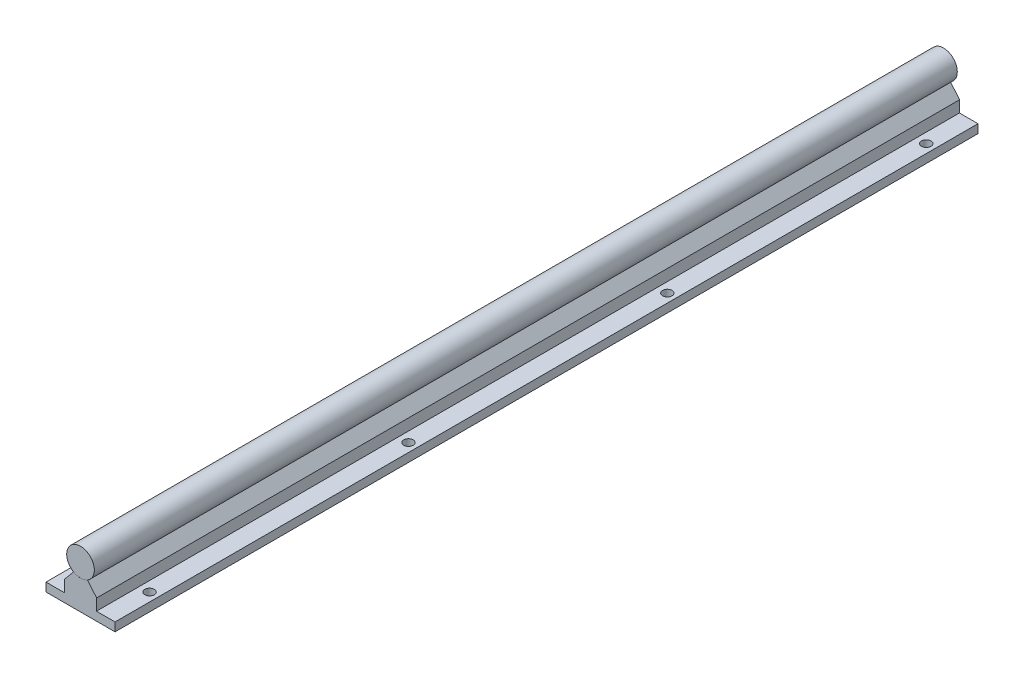
ISO-10303-21;
HEADER;
FILE_DESCRIPTION(('STEP AP214'),'2;1');
FILE_NAME('part.step','',(''),(''),'','','');
FILE_SCHEMA(('AUTOMOTIVE_DESIGN { 1 0 10303 214 1 1 1 1 }'));
ENDSEC;
DATA;
#1=APPLICATION_CONTEXT('core data for automotive mechanical design processes');
#2=APPLICATION_PROTOCOL_DEFINITION('international standard','automotive_design',2000,#1);
#3=PRODUCT_CONTEXT('',#1,'mechanical');
#4=PRODUCT('Part','Part','',(#3));
#5=PRODUCT_RELATED_PRODUCT_CATEGORY('part','',(#4));
#6=PRODUCT_DEFINITION_FORMATION('','',#4);
#7=PRODUCT_DEFINITION_CONTEXT('part definition',#1,'design');
#8=PRODUCT_DEFINITION('design','',#6,#7);
#9=PRODUCT_DEFINITION_SHAPE('','',#8);
#10=(LENGTH_UNIT() NAMED_UNIT(*) SI_UNIT(.MILLI.,.METRE.));
#11=(NAMED_UNIT(*) PLANE_ANGLE_UNIT() SI_UNIT($,.RADIAN.));
#12=(NAMED_UNIT(*) SI_UNIT($,.STERADIAN.) SOLID_ANGLE_UNIT());
#13=UNCERTAINTY_MEASURE_WITH_UNIT(LENGTH_MEASURE(1.E-05),#10,'distance_accuracy_value','');
#14=(GEOMETRIC_REPRESENTATION_CONTEXT(3) GLOBAL_UNCERTAINTY_ASSIGNED_CONTEXT((#13)) GLOBAL_UNIT_ASSIGNED_CONTEXT((#10,
#11,#12)) REPRESENTATION_CONTEXT('',''));
#15=CARTESIAN_POINT('',(0.,0.,0.));
#16=DIRECTION('',(0.,0.,1.));
#17=DIRECTION('',(1.,0.,0.));
#18=AXIS2_PLACEMENT_3D('',#15,#16,#17);
#19=CARTESIAN_POINT('',(1.29091350120477E-13,-1.82545695673485,500.));
#20=DIRECTION('',(0.,0.,-1.));
#21=DIRECTION('',(1.,0.,0.));
#22=AXIS2_PLACEMENT_3D('',#19,#20,#21);
#23=CYLINDRICAL_SURFACE('',#22,8.00000000000048);
#24=CARTESIAN_POINT('',(1.29091350120477E-13,-1.82545695673485,0.));
#25=DIRECTION('',(0.,0.,1.));
#26=DIRECTION('',(-1.,0.,0.));
#27=AXIS2_PLACEMENT_3D('',#24,#25,#26);
#28=CIRCLE('',#27,8.00000000000048);
#29=CARTESIAN_POINT('',(-4.,-8.75366018701084,0.));
#30=VERTEX_POINT('',#29);
#31=CARTESIAN_POINT('',(4.,-8.75366018701084,0.));
#32=VERTEX_POINT('',#31);
#33=EDGE_CURVE('E133',#30,#32,#28,.T.);
#34=ORIENTED_EDGE('',*,*,#33,.F.);
#35=DIRECTION('',(0.,0.,-1.));
#36=VECTOR('',#35,1.);
#37=CARTESIAN_POINT('',(-4.,-8.75366018701084,500.));
#38=LINE('',#37,#36);
#39=CARTESIAN_POINT('',(-4.,-8.75366018701084,500.));
#40=VERTEX_POINT('',#39);
#41=EDGE_CURVE('E132',#40,#30,#38,.T.);
#42=ORIENTED_EDGE('',*,*,#41,.F.);
#43=CARTESIAN_POINT('',(1.29091350120477E-13,-1.82545695673485,500.));
#44=DIRECTION('',(0.,0.,1.));
#45=DIRECTION('',(-1.,0.,0.));
#46=AXIS2_PLACEMENT_3D('',#43,#44,#45);
#47=CIRCLE('',#46,8.00000000000048);
#48=CARTESIAN_POINT('',(4.,-8.75366018701084,500.));
#49=VERTEX_POINT('',#48);
#50=EDGE_CURVE('E149',#40,#49,#47,.T.);
#51=ORIENTED_EDGE('',*,*,#50,.T.);
#52=DIRECTION('',(0.,0.,-1.));
#53=VECTOR('',#52,1.);
#54=CARTESIAN_POINT('',(4.,-8.75366018701084,500.));
#55=LINE('',#54,#53);
#56=EDGE_CURVE('E234',#49,#32,#55,.T.);
#57=ORIENTED_EDGE('',*,*,#56,.T.);
#58=EDGE_LOOP('',(#34,#42,#51,#57));
#59=FACE_BOUND('',#58,.T.);
#60=ADVANCED_FACE('F45',(#59),#23,.F.);
#61=CARTESIAN_POINT('',(-20.,-26.8254569567353,500.));
#62=DIRECTION('',(0.,1.,0.));
#63=DIRECTION('',(1.,0.,0.));
#64=AXIS2_PLACEMENT_3D('',#61,#62,#63);
#65=PLANE('',#64);
#66=CARTESIAN_POINT('',(15.,-26.8254569567353,25.0000000000001));
#67=DIRECTION('',(0.,-1.,0.));
#68=DIRECTION('',(1.,0.,0.));
#69=AXIS2_PLACEMENT_3D('',#66,#67,#68);
#70=CIRCLE('',#69,2.75);
#71=CARTESIAN_POINT('',(17.75,-26.8254569567353,25.0000000000001));
#72=VERTEX_POINT('',#71);
#73=EDGE_CURVE('E305',#72,#72,#70,.T.);
#74=ORIENTED_EDGE('',*,*,#73,.F.);
#75=EDGE_LOOP('',(#74));
#76=FACE_BOUND('',#75,.T.);
#77=CARTESIAN_POINT('',(-15.,-26.8254569567353,25.0000000000001));
#78=DIRECTION('',(0.,-1.,0.));
#79=DIRECTION('',(1.,0.,0.));
#80=AXIS2_PLACEMENT_3D('',#77,#78,#79);
#81=CIRCLE('',#80,2.75);
#82=CARTESIAN_POINT('',(-12.25,-26.8254569567353,25.0000000000001));
#83=VERTEX_POINT('',#82);
#84=EDGE_CURVE('E299',#83,#83,#81,.T.);
#85=ORIENTED_EDGE('',*,*,#84,.F.);
#86=EDGE_LOOP('',(#85));
#87=FACE_BOUND('',#86,.T.);
#88=CARTESIAN_POINT('',(15.,-26.8254569567353,175.));
#89=DIRECTION('',(0.,-1.,0.));
#90=DIRECTION('',(1.,0.,0.));
#91=AXIS2_PLACEMENT_3D('',#88,#89,#90);
#92=CIRCLE('',#91,2.75);
#93=CARTESIAN_POINT('',(17.75,-26.8254569567353,175.));
#94=VERTEX_POINT('',#93);
#95=EDGE_CURVE('E293',#94,#94,#92,.T.);
#96=ORIENTED_EDGE('',*,*,#95,.F.);
#97=EDGE_LOOP('',(#96));
#98=FACE_BOUND('',#97,.T.);
#99=CARTESIAN_POINT('',(-15.,-26.8254569567353,175.));
#100=DIRECTION('',(0.,-1.,0.));
#101=DIRECTION('',(1.,0.,0.));
#102=AXIS2_PLACEMENT_3D('',#99,#100,#101);
#103=CIRCLE('',#102,2.75);
#104=CARTESIAN_POINT('',(-12.25,-26.8254569567353,175.));
#105=VERTEX_POINT('',#104);
#106=EDGE_CURVE('E287',#105,#105,#103,.T.);
#107=ORIENTED_EDGE('',*,*,#106,.F.);
#108=EDGE_LOOP('',(#107));
#109=FACE_BOUND('',#108,.T.);
#110=CARTESIAN_POINT('',(15.,-26.8254569567353,325.));
#111=DIRECTION('',(0.,-1.,0.));
#112=DIRECTION('',(1.,0.,0.));
#113=AXIS2_PLACEMENT_3D('',#110,#111,#112);
#114=CIRCLE('',#113,2.75);
#115=CARTESIAN_POINT('',(17.75,-26.8254569567353,325.));
#116=VERTEX_POINT('',#115);
#117=EDGE_CURVE('E281',#116,#116,#114,.T.);
#118=ORIENTED_EDGE('',*,*,#117,.F.);
#119=EDGE_LOOP('',(#118));
#120=FACE_BOUND('',#119,.T.);
#121=CARTESIAN_POINT('',(-15.,-26.8254569567353,325.));
#122=DIRECTION('',(0.,-1.,0.));
#123=DIRECTION('',(1.,0.,0.));
#124=AXIS2_PLACEMENT_3D('',#121,#122,#123);
#125=CIRCLE('',#124,2.75);
#126=CARTESIAN_POINT('',(-12.25,-26.8254569567353,325.));
#127=VERTEX_POINT('',#126);
#128=EDGE_CURVE('E275',#127,#127,#125,.T.);
#129=ORIENTED_EDGE('',*,*,#128,.F.);
#130=EDGE_LOOP('',(#129));
#131=FACE_BOUND('',#130,.T.);
#132=CARTESIAN_POINT('',(15.,-26.8254569567353,475.));
#133=DIRECTION('',(0.,-1.,0.));
#134=DIRECTION('',(1.,0.,0.));
#135=AXIS2_PLACEMENT_3D('',#132,#133,#134);
#136=CIRCLE('',#135,2.75);
#137=CARTESIAN_POINT('',(17.75,-26.8254569567353,475.));
#138=VERTEX_POINT('',#137);
#139=EDGE_CURVE('E269',#138,#138,#136,.T.);
#140=ORIENTED_EDGE('',*,*,#139,.F.);
#141=EDGE_LOOP('',(#140));
#142=FACE_BOUND('',#141,.T.);
#143=CARTESIAN_POINT('',(-15.,-26.8254569567353,475.));
#144=DIRECTION('',(0.,-1.,0.));
#145=DIRECTION('',(1.,0.,0.));
#146=AXIS2_PLACEMENT_3D('',#143,#144,#145);
#147=CIRCLE('',#146,2.75);
#148=CARTESIAN_POINT('',(-12.25,-26.8254569567353,475.));
#149=VERTEX_POINT('',#148);
#150=EDGE_CURVE('E263',#149,#149,#147,.T.);
#151=ORIENTED_EDGE('',*,*,#150,.F.);
#152=EDGE_LOOP('',(#151));
#153=FACE_BOUND('',#152,.T.);
#154=DIRECTION('',(-1.,0.,0.));
#155=VECTOR('',#154,1.);
#156=CARTESIAN_POINT('',(-20.,-26.8254569567353,0.));
#157=LINE('',#156,#155);
#158=CARTESIAN_POINT('',(20.,-26.8254569567353,0.));
#159=VERTEX_POINT('',#158);
#160=CARTESIAN_POINT('',(-20.,-26.8254569567353,0.));
#161=VERTEX_POINT('',#160);
#162=EDGE_CURVE('E135',#159,#161,#157,.T.);
#163=ORIENTED_EDGE('',*,*,#162,.F.);
#164=DIRECTION('',(0.,0.,-1.));
#165=VECTOR('',#164,1.);
#166=CARTESIAN_POINT('',(20.,-26.8254569567353,500.));
#167=LINE('',#166,#165);
#168=CARTESIAN_POINT('',(20.,-26.8254569567353,500.));
#169=VERTEX_POINT('',#168);
#170=EDGE_CURVE('E136',#169,#159,#167,.T.);
#171=ORIENTED_EDGE('',*,*,#170,.F.);
#172=DIRECTION('',(-1.,0.,0.));
#173=VECTOR('',#172,1.);
#174=CARTESIAN_POINT('',(-20.,-26.8254569567353,500.));
#175=LINE('',#174,#173);
#176=CARTESIAN_POINT('',(-20.,-26.8254569567353,500.));
#177=VERTEX_POINT('',#176);
#178=EDGE_CURVE('E187',#169,#177,#175,.T.);
#179=ORIENTED_EDGE('',*,*,#178,.T.);
#180=DIRECTION('',(0.,0.,-1.));
#181=VECTOR('',#180,1.);
#182=CARTESIAN_POINT('',(-20.,-26.8254569567353,500.));
#183=LINE('',#182,#181);
#184=EDGE_CURVE('E12',#177,#161,#183,.T.);
#185=ORIENTED_EDGE('',*,*,#184,.T.);
#186=EDGE_LOOP('',(#163,#171,#179,#185));
#187=FACE_BOUND('',#186,.T.);
#188=ADVANCED_FACE('F167',(#76,#87,#98,#109,#120,#131,#142,#153,#187),#65,.F.);
#189=CARTESIAN_POINT('',(-20.,-21.8254569567353,500.));
#190=DIRECTION('',(1.,0.,0.));
#191=DIRECTION('',(0.,-1.,0.));
#192=AXIS2_PLACEMENT_3D('',#189,#190,#191);
#193=PLANE('',#192);
#194=DIRECTION('',(0.,1.,0.));
#195=VECTOR('',#194,1.);
#196=CARTESIAN_POINT('',(-20.,-21.8254569567353,0.));
#197=LINE('',#196,#195);
#198=CARTESIAN_POINT('',(-20.,-21.8254569567353,0.));
#199=VERTEX_POINT('',#198);
#200=EDGE_CURVE('E139',#161,#199,#197,.T.);
#201=ORIENTED_EDGE('',*,*,#200,.F.);
#202=ORIENTED_EDGE('',*,*,#184,.F.);
#203=DIRECTION('',(0.,1.,0.));
#204=VECTOR('',#203,1.);
#205=CARTESIAN_POINT('',(-20.,-21.8254569567353,500.));
#206=LINE('',#205,#204);
#207=CARTESIAN_POINT('',(-20.,-21.8254569567353,500.));
#208=VERTEX_POINT('',#207);
#209=EDGE_CURVE('E95',#177,#208,#206,.T.);
#210=ORIENTED_EDGE('',*,*,#209,.T.);
#211=DIRECTION('',(0.,0.,-1.));
#212=VECTOR('',#211,1.);
#213=CARTESIAN_POINT('',(-20.,-21.8254569567353,500.));
#214=LINE('',#213,#212);
#215=EDGE_CURVE('E53',#208,#199,#214,.T.);
#216=ORIENTED_EDGE('',*,*,#215,.T.);
#217=EDGE_LOOP('',(#201,#202,#210,#216));
#218=FACE_BOUND('',#217,.T.);
#219=ADVANCED_FACE('F155',(#218),#193,.F.);
#220=CARTESIAN_POINT('',(-9.24999999999999,-21.8254569567353,500.));
#221=DIRECTION('',(0.,-1.,0.));
#222=DIRECTION('',(0.,0.,-1.));
#223=AXIS2_PLACEMENT_3D('',#220,#221,#222);
#224=PLANE('',#223);
#225=CARTESIAN_POINT('',(-15.,-21.8254569567353,25.0000000000001));
#226=DIRECTION('',(0.,-1.,0.));
#227=DIRECTION('',(1.,0.,0.));
#228=AXIS2_PLACEMENT_3D('',#225,#226,#227);
#229=CIRCLE('',#228,2.75);
#230=CARTESIAN_POINT('',(-12.25,-21.8254569567353,25.0000000000001));
#231=VERTEX_POINT('',#230);
#232=EDGE_CURVE('E296',#231,#231,#229,.F.);
#233=ORIENTED_EDGE('',*,*,#232,.F.);
#234=EDGE_LOOP('',(#233));
#235=FACE_BOUND('',#234,.T.);
#236=CARTESIAN_POINT('',(-15.,-21.8254569567353,175.));
#237=DIRECTION('',(0.,-1.,0.));
#238=DIRECTION('',(1.,0.,0.));
#239=AXIS2_PLACEMENT_3D('',#236,#237,#238);
#240=CIRCLE('',#239,2.75);
#241=CARTESIAN_POINT('',(-12.25,-21.8254569567353,175.));
#242=VERTEX_POINT('',#241);
#243=EDGE_CURVE('E284',#242,#242,#240,.F.);
#244=ORIENTED_EDGE('',*,*,#243,.F.);
#245=EDGE_LOOP('',(#244));
#246=FACE_BOUND('',#245,.T.);
#247=CARTESIAN_POINT('',(-15.,-21.8254569567353,325.));
#248=DIRECTION('',(0.,-1.,0.));
#249=DIRECTION('',(1.,0.,0.));
#250=AXIS2_PLACEMENT_3D('',#247,#248,#249);
#251=CIRCLE('',#250,2.75);
#252=CARTESIAN_POINT('',(-12.25,-21.8254569567353,325.));
#253=VERTEX_POINT('',#252);
#254=EDGE_CURVE('E272',#253,#253,#251,.F.);
#255=ORIENTED_EDGE('',*,*,#254,.F.);
#256=EDGE_LOOP('',(#255));
#257=FACE_BOUND('',#256,.T.);
#258=CARTESIAN_POINT('',(-15.,-21.8254569567353,475.));
#259=DIRECTION('',(0.,-1.,0.));
#260=DIRECTION('',(1.,0.,0.));
#261=AXIS2_PLACEMENT_3D('',#258,#259,#260);
#262=CIRCLE('',#261,2.75);
#263=CARTESIAN_POINT('',(-12.25,-21.8254569567353,475.));
#264=VERTEX_POINT('',#263);
#265=EDGE_CURVE('E255',#264,#264,#262,.F.);
#266=ORIENTED_EDGE('',*,*,#265,.F.);
#267=EDGE_LOOP('',(#266));
#268=FACE_BOUND('',#267,.T.);
#269=DIRECTION('',(1.,0.,0.));
#270=VECTOR('',#269,1.);
#271=CARTESIAN_POINT('',(-9.24999999999999,-21.8254569567353,0.));
#272=LINE('',#271,#270);
#273=CARTESIAN_POINT('',(-9.24999999999999,-21.8254569567353,0.));
#274=VERTEX_POINT('',#273);
#275=EDGE_CURVE('E142',#199,#274,#272,.T.);
#276=ORIENTED_EDGE('',*,*,#275,.F.);
#277=ORIENTED_EDGE('',*,*,#215,.F.);
#278=DIRECTION('',(1.,0.,0.));
#279=VECTOR('',#278,1.);
#280=CARTESIAN_POINT('',(-9.24999999999999,-21.8254569567353,500.));
#281=LINE('',#280,#279);
#282=CARTESIAN_POINT('',(-9.24999999999999,-21.8254569567353,500.));
#283=VERTEX_POINT('',#282);
#284=EDGE_CURVE('E126',#208,#283,#281,.T.);
#285=ORIENTED_EDGE('',*,*,#284,.T.);
#286=DIRECTION('',(0.,0.,-1.));
#287=VECTOR('',#286,1.);
#288=CARTESIAN_POINT('',(-9.24999999999999,-21.8254569567353,500.));
#289=LINE('',#288,#287);
#290=EDGE_CURVE('E120',#283,#274,#289,.T.);
#291=ORIENTED_EDGE('',*,*,#290,.T.);
#292=EDGE_LOOP('',(#276,#277,#285,#291));
#293=FACE_BOUND('',#292,.T.);
#294=ADVANCED_FACE('F335',(#235,#246,#257,#268,#293),#224,.F.);
#295=CARTESIAN_POINT('',(-9.25,-15.1254569567353,500.));
#296=DIRECTION('',(1.,0.,0.));
#297=DIRECTION('',(0.,0.,1.));
#298=AXIS2_PLACEMENT_3D('',#295,#296,#297);
#299=PLANE('',#298);
#300=DIRECTION('',(0.,1.,0.));
#301=VECTOR('',#300,1.);
#302=CARTESIAN_POINT('',(-9.25,-15.1254569567353,0.));
#303=LINE('',#302,#301);
#304=CARTESIAN_POINT('',(-9.25,-15.1254569567353,0.));
#305=VERTEX_POINT('',#304);
#306=EDGE_CURVE('E145',#274,#305,#303,.T.);
#307=ORIENTED_EDGE('',*,*,#306,.F.);
#308=ORIENTED_EDGE('',*,*,#290,.F.);
#309=DIRECTION('',(0.,1.,0.));
#310=VECTOR('',#309,1.);
#311=CARTESIAN_POINT('',(-9.25,-15.1254569567353,500.));
#312=LINE('',#311,#310);
#313=CARTESIAN_POINT('',(-9.25,-15.1254569567353,500.));
#314=VERTEX_POINT('',#313);
#315=EDGE_CURVE('E110',#283,#314,#312,.T.);
#316=ORIENTED_EDGE('',*,*,#315,.T.);
#317=DIRECTION('',(0.,0.,-1.));
#318=VECTOR('',#317,1.);
#319=CARTESIAN_POINT('',(-9.25,-15.1254569567353,500.));
#320=LINE('',#319,#318);
#321=EDGE_CURVE('E115',#314,#305,#320,.T.);
#322=ORIENTED_EDGE('',*,*,#321,.T.);
#323=EDGE_LOOP('',(#307,#308,#316,#322));
#324=FACE_BOUND('',#323,.T.);
#325=ADVANCED_FACE('F123',(#324),#299,.F.);
#326=CARTESIAN_POINT('',(-9.34657231941235,-15.1254569567353,500.));
#327=DIRECTION('',(0.,1.,0.));
#328=DIRECTION('',(0.,0.,1.));
#329=AXIS2_PLACEMENT_3D('',#326,#327,#328);
#330=PLANE('',#329);
#331=DIRECTION('',(-1.,0.,0.));
#332=VECTOR('',#331,1.);
#333=CARTESIAN_POINT('',(-9.34657231941235,-15.1254569567353,0.));
#334=LINE('',#333,#332);
#335=CARTESIAN_POINT('',(-9.34657231941235,-15.1254569567353,0.));
#336=VERTEX_POINT('',#335);
#337=EDGE_CURVE('E117',#305,#336,#334,.T.);
#338=ORIENTED_EDGE('',*,*,#337,.F.);
#339=ORIENTED_EDGE('',*,*,#321,.F.);
#340=DIRECTION('',(-1.,0.,0.));
#341=VECTOR('',#340,1.);
#342=CARTESIAN_POINT('',(-9.34657231941235,-15.1254569567353,500.));
#343=LINE('',#342,#341);
#344=CARTESIAN_POINT('',(-9.34657231941235,-15.1254569567353,500.));
#345=VERTEX_POINT('',#344);
#346=EDGE_CURVE('E106',#314,#345,#343,.T.);
#347=ORIENTED_EDGE('',*,*,#346,.T.);
#348=DIRECTION('',(0.,0.,-1.));
#349=VECTOR('',#348,1.);
#350=CARTESIAN_POINT('',(-9.34657231941235,-15.1254569567353,500.));
#351=LINE('',#350,#349);
#352=EDGE_CURVE('E121',#345,#336,#351,.T.);
#353=ORIENTED_EDGE('',*,*,#352,.T.);
#354=EDGE_LOOP('',(#338,#339,#347,#353));
#355=FACE_BOUND('',#354,.T.);
#356=ADVANCED_FACE('F116',(#355),#330,.F.);
#357=CARTESIAN_POINT('',(-4.,-8.75366018701084,500.));
#358=DIRECTION('',(0.766044443118982,-0.642787609686535,0.));
#359=DIRECTION('',(-0.642787609686535,-0.766044443118982,0.));
#360=AXIS2_PLACEMENT_3D('',#357,#358,#359);
#361=PLANE('',#360);
#362=DIRECTION('',(0.642787609686535,0.766044443118982,0.));
#363=VECTOR('',#362,1.);
#364=CARTESIAN_POINT('',(-4.,-8.75366018701084,0.));
#365=LINE('',#364,#363);
#366=EDGE_CURVE('E82',#336,#30,#365,.T.);
#367=ORIENTED_EDGE('',*,*,#366,.F.);
#368=ORIENTED_EDGE('',*,*,#352,.F.);
#369=DIRECTION('',(0.642787609686535,0.766044443118982,0.));
#370=VECTOR('',#369,1.);
#371=CARTESIAN_POINT('',(-4.,-8.75366018701084,500.));
#372=LINE('',#371,#370);
#373=EDGE_CURVE('E61',#345,#40,#372,.T.);
#374=ORIENTED_EDGE('',*,*,#373,.T.);
#375=ORIENTED_EDGE('',*,*,#41,.T.);
#376=EDGE_LOOP('',(#367,#368,#374,#375));
#377=FACE_BOUND('',#376,.T.);
#378=ADVANCED_FACE('F368',(#377),#361,.F.);
#379=CARTESIAN_POINT('',(1.29091350120477E-13,-1.82545695673485,500.));
#380=DIRECTION('',(0.,0.,1.));
#381=DIRECTION('',(-1.,0.,0.));
#382=AXIS2_PLACEMENT_3D('',#379,#380,#381);
#383=PLANE('',#382);
#384=ORIENTED_EDGE('',*,*,#50,.F.);
#385=ORIENTED_EDGE('',*,*,#373,.F.);
#386=ORIENTED_EDGE('',*,*,#346,.F.);
#387=ORIENTED_EDGE('',*,*,#315,.F.);
#388=ORIENTED_EDGE('',*,*,#284,.F.);
#389=ORIENTED_EDGE('',*,*,#209,.F.);
#390=ORIENTED_EDGE('',*,*,#178,.F.);
#391=DIRECTION('',(0.,1.,0.));
#392=VECTOR('',#391,1.);
#393=CARTESIAN_POINT('',(20.,-21.8254569567353,500.));
#394=LINE('',#393,#392);
#395=CARTESIAN_POINT('',(20.,-21.8254569567353,500.));
#396=VERTEX_POINT('',#395);
#397=EDGE_CURVE('E178',#169,#396,#394,.T.);
#398=ORIENTED_EDGE('',*,*,#397,.T.);
#399=DIRECTION('',(-1.,0.,0.));
#400=VECTOR('',#399,1.);
#401=CARTESIAN_POINT('',(9.25,-21.8254569567353,500.));
#402=LINE('',#401,#400);
#403=CARTESIAN_POINT('',(9.25,-21.8254569567353,500.));
#404=VERTEX_POINT('',#403);
#405=EDGE_CURVE('E238',#396,#404,#402,.T.);
#406=ORIENTED_EDGE('',*,*,#405,.T.);
#407=DIRECTION('',(0.,1.,0.));
#408=VECTOR('',#407,1.);
#409=CARTESIAN_POINT('',(9.25,-15.1254569567353,500.));
#410=LINE('',#409,#408);
#411=CARTESIAN_POINT('',(9.25,-15.1254569567353,500.));
#412=VERTEX_POINT('',#411);
#413=EDGE_CURVE('E248',#404,#412,#410,.T.);
#414=ORIENTED_EDGE('',*,*,#413,.T.);
#415=DIRECTION('',(1.,0.,0.));
#416=VECTOR('',#415,1.);
#417=CARTESIAN_POINT('',(9.34657231941235,-15.1254569567353,500.));
#418=LINE('',#417,#416);
#419=CARTESIAN_POINT('',(9.34657231941235,-15.1254569567353,500.));
#420=VERTEX_POINT('',#419);
#421=EDGE_CURVE('E257',#412,#420,#418,.T.);
#422=ORIENTED_EDGE('',*,*,#421,.T.);
#423=DIRECTION('',(-0.642787609686535,0.766044443118982,0.));
#424=VECTOR('',#423,1.);
#425=CARTESIAN_POINT('',(4.,-8.75366018701084,500.));
#426=LINE('',#425,#424);
#427=EDGE_CURVE('E233',#420,#49,#426,.T.);
#428=ORIENTED_EDGE('',*,*,#427,.T.);
#429=EDGE_LOOP('',(#384,#385,#386,#387,#388,#389,#390,#398,#406,#414,#422,#428));
#430=FACE_BOUND('',#429,.T.);
#431=ADVANCED_FACE('F108',(#430),#383,.T.);
#432=CARTESIAN_POINT('',(1.29091350120477E-13,-1.82545695673485,0.));
#433=DIRECTION('',(0.,0.,1.));
#434=DIRECTION('',(-1.,0.,0.));
#435=AXIS2_PLACEMENT_3D('',#432,#433,#434);
#436=PLANE('',#435);
#437=ORIENTED_EDGE('',*,*,#33,.T.);
#438=DIRECTION('',(-0.642787609686535,0.766044443118982,0.));
#439=VECTOR('',#438,1.);
#440=CARTESIAN_POINT('',(4.,-8.75366018701084,0.));
#441=LINE('',#440,#439);
#442=CARTESIAN_POINT('',(9.34657231941235,-15.1254569567353,0.));
#443=VERTEX_POINT('',#442);
#444=EDGE_CURVE('E224',#443,#32,#441,.T.);
#445=ORIENTED_EDGE('',*,*,#444,.F.);
#446=DIRECTION('',(1.,0.,0.));
#447=VECTOR('',#446,1.);
#448=CARTESIAN_POINT('',(9.34657231941235,-15.1254569567353,0.));
#449=LINE('',#448,#447);
#450=CARTESIAN_POINT('',(9.25,-15.1254569567353,0.));
#451=VERTEX_POINT('',#450);
#452=EDGE_CURVE('E214',#451,#443,#449,.T.);
#453=ORIENTED_EDGE('',*,*,#452,.F.);
#454=DIRECTION('',(0.,1.,0.));
#455=VECTOR('',#454,1.);
#456=CARTESIAN_POINT('',(9.25,-15.1254569567353,0.));
#457=LINE('',#456,#455);
#458=CARTESIAN_POINT('',(9.25,-21.8254569567353,0.));
#459=VERTEX_POINT('',#458);
#460=EDGE_CURVE('E225',#459,#451,#457,.T.);
#461=ORIENTED_EDGE('',*,*,#460,.F.);
#462=DIRECTION('',(-1.,0.,0.));
#463=VECTOR('',#462,1.);
#464=CARTESIAN_POINT('',(9.25,-21.8254569567353,0.));
#465=LINE('',#464,#463);
#466=CARTESIAN_POINT('',(20.,-21.8254569567353,0.));
#467=VERTEX_POINT('',#466);
#468=EDGE_CURVE('E251',#467,#459,#465,.T.);
#469=ORIENTED_EDGE('',*,*,#468,.F.);
#470=DIRECTION('',(0.,1.,0.));
#471=VECTOR('',#470,1.);
#472=CARTESIAN_POINT('',(20.,-21.8254569567353,0.));
#473=LINE('',#472,#471);
#474=EDGE_CURVE('E163',#159,#467,#473,.T.);
#475=ORIENTED_EDGE('',*,*,#474,.F.);
#476=ORIENTED_EDGE('',*,*,#162,.T.);
#477=ORIENTED_EDGE('',*,*,#200,.T.);
#478=ORIENTED_EDGE('',*,*,#275,.T.);
#479=ORIENTED_EDGE('',*,*,#306,.T.);
#480=ORIENTED_EDGE('',*,*,#337,.T.);
#481=ORIENTED_EDGE('',*,*,#366,.T.);
#482=EDGE_LOOP('',(#437,#445,#453,#461,#469,#475,#476,#477,#478,#479,#480,#481));
#483=FACE_BOUND('',#482,.T.);
#484=ADVANCED_FACE('F157',(#483),#436,.F.);
#485=CARTESIAN_POINT('',(20.,-21.8254569567353,500.));
#486=DIRECTION('',(-1.,0.,0.));
#487=DIRECTION('',(0.,-1.,0.));
#488=AXIS2_PLACEMENT_3D('',#485,#486,#487);
#489=PLANE('',#488);
#490=ORIENTED_EDGE('',*,*,#474,.T.);
#491=DIRECTION('',(0.,0.,-1.));
#492=VECTOR('',#491,1.);
#493=CARTESIAN_POINT('',(20.,-21.8254569567353,500.));
#494=LINE('',#493,#492);
#495=EDGE_CURVE('E179',#396,#467,#494,.T.);
#496=ORIENTED_EDGE('',*,*,#495,.F.);
#497=ORIENTED_EDGE('',*,*,#397,.F.);
#498=ORIENTED_EDGE('',*,*,#170,.T.);
#499=EDGE_LOOP('',(#490,#496,#497,#498));
#500=FACE_BOUND('',#499,.T.);
#501=ADVANCED_FACE('F174',(#500),#489,.F.);
#502=CARTESIAN_POINT('',(9.25,-21.8254569567353,500.));
#503=DIRECTION('',(0.,-1.,0.));
#504=DIRECTION('',(0.,0.,-1.));
#505=AXIS2_PLACEMENT_3D('',#502,#503,#504);
#506=PLANE('',#505);
#507=CARTESIAN_POINT('',(15.,-21.8254569567353,25.0000000000001));
#508=DIRECTION('',(0.,-1.,0.));
#509=DIRECTION('',(0.,0.,-1.));
#510=AXIS2_PLACEMENT_3D('',#507,#508,#509);
#511=CIRCLE('',#510,2.75);
#512=CARTESIAN_POINT('',(15.,-21.8254569567353,22.2500000000001));
#513=VERTEX_POINT('',#512);
#514=EDGE_CURVE('E302',#513,#513,#511,.F.);
#515=ORIENTED_EDGE('',*,*,#514,.F.);
#516=EDGE_LOOP('',(#515));
#517=FACE_BOUND('',#516,.T.);
#518=CARTESIAN_POINT('',(15.,-21.8254569567353,175.));
#519=DIRECTION('',(0.,-1.,0.));
#520=DIRECTION('',(0.,0.,-1.));
#521=AXIS2_PLACEMENT_3D('',#518,#519,#520);
#522=CIRCLE('',#521,2.75);
#523=CARTESIAN_POINT('',(15.,-21.8254569567353,172.25));
#524=VERTEX_POINT('',#523);
#525=EDGE_CURVE('E290',#524,#524,#522,.F.);
#526=ORIENTED_EDGE('',*,*,#525,.F.);
#527=EDGE_LOOP('',(#526));
#528=FACE_BOUND('',#527,.T.);
#529=CARTESIAN_POINT('',(15.,-21.8254569567353,325.));
#530=DIRECTION('',(0.,-1.,0.));
#531=DIRECTION('',(0.,0.,-1.));
#532=AXIS2_PLACEMENT_3D('',#529,#530,#531);
#533=CIRCLE('',#532,2.75);
#534=CARTESIAN_POINT('',(15.,-21.8254569567353,322.25));
#535=VERTEX_POINT('',#534);
#536=EDGE_CURVE('E278',#535,#535,#533,.F.);
#537=ORIENTED_EDGE('',*,*,#536,.F.);
#538=EDGE_LOOP('',(#537));
#539=FACE_BOUND('',#538,.T.);
#540=CARTESIAN_POINT('',(15.,-21.8254569567353,475.));
#541=DIRECTION('',(0.,-1.,0.));
#542=DIRECTION('',(0.,0.,-1.));
#543=AXIS2_PLACEMENT_3D('',#540,#541,#542);
#544=CIRCLE('',#543,2.75);
#545=CARTESIAN_POINT('',(15.,-21.8254569567353,472.25));
#546=VERTEX_POINT('',#545);
#547=EDGE_CURVE('E266',#546,#546,#544,.F.);
#548=ORIENTED_EDGE('',*,*,#547,.F.);
#549=EDGE_LOOP('',(#548));
#550=FACE_BOUND('',#549,.T.);
#551=ORIENTED_EDGE('',*,*,#468,.T.);
#552=DIRECTION('',(0.,0.,-1.));
#553=VECTOR('',#552,1.);
#554=CARTESIAN_POINT('',(9.25,-21.8254569567353,500.));
#555=LINE('',#554,#553);
#556=EDGE_CURVE('E181',#404,#459,#555,.T.);
#557=ORIENTED_EDGE('',*,*,#556,.F.);
#558=ORIENTED_EDGE('',*,*,#405,.F.);
#559=ORIENTED_EDGE('',*,*,#495,.T.);
#560=EDGE_LOOP('',(#551,#557,#558,#559));
#561=FACE_BOUND('',#560,.T.);
#562=ADVANCED_FACE('F352',(#517,#528,#539,#550,#561),#506,.F.);
#563=CARTESIAN_POINT('',(9.25,-15.1254569567353,500.));
#564=DIRECTION('',(-1.,0.,0.));
#565=DIRECTION('',(0.,0.,1.));
#566=AXIS2_PLACEMENT_3D('',#563,#564,#565);
#567=PLANE('',#566);
#568=ORIENTED_EDGE('',*,*,#460,.T.);
#569=DIRECTION('',(0.,0.,-1.));
#570=VECTOR('',#569,1.);
#571=CARTESIAN_POINT('',(9.25,-15.1254569567353,500.));
#572=LINE('',#571,#570);
#573=EDGE_CURVE('E221',#412,#451,#572,.T.);
#574=ORIENTED_EDGE('',*,*,#573,.F.);
#575=ORIENTED_EDGE('',*,*,#413,.F.);
#576=ORIENTED_EDGE('',*,*,#556,.T.);
#577=EDGE_LOOP('',(#568,#574,#575,#576));
#578=FACE_BOUND('',#577,.T.);
#579=ADVANCED_FACE('F247',(#578),#567,.F.);
#580=CARTESIAN_POINT('',(9.34657231941235,-15.1254569567353,500.));
#581=DIRECTION('',(0.,1.,0.));
#582=DIRECTION('',(0.,0.,1.));
#583=AXIS2_PLACEMENT_3D('',#580,#581,#582);
#584=PLANE('',#583);
#585=ORIENTED_EDGE('',*,*,#452,.T.);
#586=DIRECTION('',(0.,0.,-1.));
#587=VECTOR('',#586,1.);
#588=CARTESIAN_POINT('',(9.34657231941235,-15.1254569567353,500.));
#589=LINE('',#588,#587);
#590=EDGE_CURVE('E218',#420,#443,#589,.T.);
#591=ORIENTED_EDGE('',*,*,#590,.F.);
#592=ORIENTED_EDGE('',*,*,#421,.F.);
#593=ORIENTED_EDGE('',*,*,#573,.T.);
#594=EDGE_LOOP('',(#585,#591,#592,#593));
#595=FACE_BOUND('',#594,.T.);
#596=ADVANCED_FACE('F216',(#595),#584,.F.);
#597=CARTESIAN_POINT('',(4.,-8.75366018701084,500.));
#598=DIRECTION('',(-0.766044443118982,-0.642787609686535,0.));
#599=DIRECTION('',(0.642787609686535,-0.766044443118982,0.));
#600=AXIS2_PLACEMENT_3D('',#597,#598,#599);
#601=PLANE('',#600);
#602=ORIENTED_EDGE('',*,*,#444,.T.);
#603=ORIENTED_EDGE('',*,*,#56,.F.);
#604=ORIENTED_EDGE('',*,*,#427,.F.);
#605=ORIENTED_EDGE('',*,*,#590,.T.);
#606=EDGE_LOOP('',(#602,#603,#604,#605));
#607=FACE_BOUND('',#606,.T.);
#608=ADVANCED_FACE('F229',(#607),#601,.F.);
#609=CARTESIAN_POINT('',(-15.,6.17554304326466,475.));
#610=DIRECTION('',(0.,-1.,0.));
#611=DIRECTION('',(1.,0.,0.));
#612=AXIS2_PLACEMENT_3D('',#609,#610,#611);
#613=CYLINDRICAL_SURFACE('',#612,2.75);
#614=ORIENTED_EDGE('',*,*,#150,.T.);
#615=EDGE_LOOP('',(#614));
#616=FACE_BOUND('',#615,.T.);
#617=ORIENTED_EDGE('',*,*,#265,.T.);
#618=EDGE_LOOP('',(#617));
#619=FACE_BOUND('',#618,.T.);
#620=ADVANCED_FACE('F328',(#616,#619),#613,.F.);
#621=CARTESIAN_POINT('',(15.,6.17554304326467,475.));
#622=DIRECTION('',(0.,-1.,0.));
#623=DIRECTION('',(1.,0.,0.));
#624=AXIS2_PLACEMENT_3D('',#621,#622,#623);
#625=CYLINDRICAL_SURFACE('',#624,2.75);
#626=ORIENTED_EDGE('',*,*,#139,.T.);
#627=EDGE_LOOP('',(#626));
#628=FACE_BOUND('',#627,.T.);
#629=ORIENTED_EDGE('',*,*,#547,.T.);
#630=EDGE_LOOP('',(#629));
#631=FACE_BOUND('',#630,.T.);
#632=ADVANCED_FACE('F331',(#628,#631),#625,.F.);
#633=CARTESIAN_POINT('',(-15.,6.17554304326466,325.));
#634=DIRECTION('',(0.,-1.,0.));
#635=DIRECTION('',(1.,0.,0.));
#636=AXIS2_PLACEMENT_3D('',#633,#634,#635);
#637=CYLINDRICAL_SURFACE('',#636,2.75);
#638=ORIENTED_EDGE('',*,*,#128,.T.);
#639=EDGE_LOOP('',(#638));
#640=FACE_BOUND('',#639,.T.);
#641=ORIENTED_EDGE('',*,*,#254,.T.);
#642=EDGE_LOOP('',(#641));
#643=FACE_BOUND('',#642,.T.);
#644=ADVANCED_FACE('F431',(#640,#643),#637,.F.);
#645=CARTESIAN_POINT('',(15.,6.17554304326467,325.));
#646=DIRECTION('',(0.,-1.,0.));
#647=DIRECTION('',(1.,0.,0.));
#648=AXIS2_PLACEMENT_3D('',#645,#646,#647);
#649=CYLINDRICAL_SURFACE('',#648,2.75);
#650=ORIENTED_EDGE('',*,*,#117,.T.);
#651=EDGE_LOOP('',(#650));
#652=FACE_BOUND('',#651,.T.);
#653=ORIENTED_EDGE('',*,*,#536,.T.);
#654=EDGE_LOOP('',(#653));
#655=FACE_BOUND('',#654,.T.);
#656=ADVANCED_FACE('F440',(#652,#655),#649,.F.);
#657=CARTESIAN_POINT('',(-15.,6.17554304326466,175.));
#658=DIRECTION('',(0.,-1.,0.));
#659=DIRECTION('',(1.,0.,0.));
#660=AXIS2_PLACEMENT_3D('',#657,#658,#659);
#661=CYLINDRICAL_SURFACE('',#660,2.75);
#662=ORIENTED_EDGE('',*,*,#106,.T.);
#663=EDGE_LOOP('',(#662));
#664=FACE_BOUND('',#663,.T.);
#665=ORIENTED_EDGE('',*,*,#243,.T.);
#666=EDGE_LOOP('',(#665));
#667=FACE_BOUND('',#666,.T.);
#668=ADVANCED_FACE('F448',(#664,#667),#661,.F.);
#669=CARTESIAN_POINT('',(15.,6.17554304326467,175.));
#670=DIRECTION('',(0.,-1.,0.));
#671=DIRECTION('',(1.,0.,0.));
#672=AXIS2_PLACEMENT_3D('',#669,#670,#671);
#673=CYLINDRICAL_SURFACE('',#672,2.75);
#674=ORIENTED_EDGE('',*,*,#95,.T.);
#675=EDGE_LOOP('',(#674));
#676=FACE_BOUND('',#675,.T.);
#677=ORIENTED_EDGE('',*,*,#525,.T.);
#678=EDGE_LOOP('',(#677));
#679=FACE_BOUND('',#678,.T.);
#680=ADVANCED_FACE('F456',(#676,#679),#673,.F.);
#681=CARTESIAN_POINT('',(-15.,6.17554304326466,25.0000000000001));
#682=DIRECTION('',(0.,-1.,0.));
#683=DIRECTION('',(1.,0.,0.));
#684=AXIS2_PLACEMENT_3D('',#681,#682,#683);
#685=CYLINDRICAL_SURFACE('',#684,2.75);
#686=ORIENTED_EDGE('',*,*,#84,.T.);
#687=EDGE_LOOP('',(#686));
#688=FACE_BOUND('',#687,.T.);
#689=ORIENTED_EDGE('',*,*,#232,.T.);
#690=EDGE_LOOP('',(#689));
#691=FACE_BOUND('',#690,.T.);
#692=ADVANCED_FACE('F465',(#688,#691),#685,.F.);
#693=CARTESIAN_POINT('',(15.,6.17554304326467,25.0000000000001));
#694=DIRECTION('',(0.,-1.,0.));
#695=DIRECTION('',(1.,0.,0.));
#696=AXIS2_PLACEMENT_3D('',#693,#694,#695);
#697=CYLINDRICAL_SURFACE('',#696,2.75);
#698=ORIENTED_EDGE('',*,*,#73,.T.);
#699=EDGE_LOOP('',(#698));
#700=FACE_BOUND('',#699,.T.);
#701=ORIENTED_EDGE('',*,*,#514,.T.);
#702=EDGE_LOOP('',(#701));
#703=FACE_BOUND('',#702,.T.);
#704=ADVANCED_FACE('F309',(#700,#703),#697,.F.);
#705=CLOSED_SHELL('',(#60,#188,#219,#294,#325,#356,#378,#431,#484,#501,#562,#579,#596,#608,#620,
#632,#644,#656,#668,#680,#692,#704));
#706=MANIFOLD_SOLID_BREP('B2',#705);
#707=CARTESIAN_POINT('',(0.,-1.82545695673533,500.));
#708=DIRECTION('',(0.,0.,-1.));
#709=DIRECTION('',(-1.,0.,0.));
#710=AXIS2_PLACEMENT_3D('',#707,#708,#709);
#711=CYLINDRICAL_SURFACE('',#710,8.);
#712=CARTESIAN_POINT('',(0.,-1.82545695673533,500.));
#713=DIRECTION('',(0.,0.,1.));
#714=DIRECTION('',(1.,0.,0.));
#715=AXIS2_PLACEMENT_3D('',#712,#713,#714);
#716=CIRCLE('',#715,8.);
#717=CARTESIAN_POINT('',(8.,-1.82545695673533,500.));
#718=VERTEX_POINT('',#717);
#719=EDGE_CURVE('E44',#718,#718,#716,.T.);
#720=ORIENTED_EDGE('',*,*,#719,.F.);
#721=EDGE_LOOP('',(#720));
#722=FACE_BOUND('',#721,.T.);
#723=CARTESIAN_POINT('',(0.,-1.82545695673533,0.));
#724=DIRECTION('',(0.,0.,1.));
#725=DIRECTION('',(1.,0.,0.));
#726=AXIS2_PLACEMENT_3D('',#723,#724,#725);
#727=CIRCLE('',#726,8.);
#728=CARTESIAN_POINT('',(8.,-1.82545695673533,0.));
#729=VERTEX_POINT('',#728);
#730=EDGE_CURVE('E581',#729,#729,#727,.T.);
#731=ORIENTED_EDGE('',*,*,#730,.T.);
#732=EDGE_LOOP('',(#731));
#733=FACE_BOUND('',#732,.T.);
#734=ADVANCED_FACE('F578',(#722,#733),#711,.T.);
#735=CARTESIAN_POINT('',(0.,-1.82545695673533,500.));
#736=DIRECTION('',(0.,0.,1.));
#737=DIRECTION('',(1.,0.,0.));
#738=AXIS2_PLACEMENT_3D('',#735,#736,#737);
#739=PLANE('',#738);
#740=ORIENTED_EDGE('',*,*,#719,.T.);
#741=EDGE_LOOP('',(#740));
#742=FACE_BOUND('',#741,.T.);
#743=ADVANCED_FACE('F593',(#742),#739,.T.);
#744=CARTESIAN_POINT('',(0.,-1.82545695673533,0.));
#745=DIRECTION('',(0.,0.,1.));
#746=DIRECTION('',(1.,0.,0.));
#747=AXIS2_PLACEMENT_3D('',#744,#745,#746);
#748=PLANE('',#747);
#749=ORIENTED_EDGE('',*,*,#730,.F.);
#750=EDGE_LOOP('',(#749));
#751=FACE_BOUND('',#750,.T.);
#752=ADVANCED_FACE('F591',(#751),#748,.F.);
#753=CLOSED_SHELL('',(#734,#743,#752));
#754=MANIFOLD_SOLID_BREP('B6',#753);
#755=ADVANCED_BREP_SHAPE_REPRESENTATION('',(#18,#706,#754),#14);
#756=SHAPE_DEFINITION_REPRESENTATION(#9,#755);
ENDSEC;
END-ISO-10303-21;
